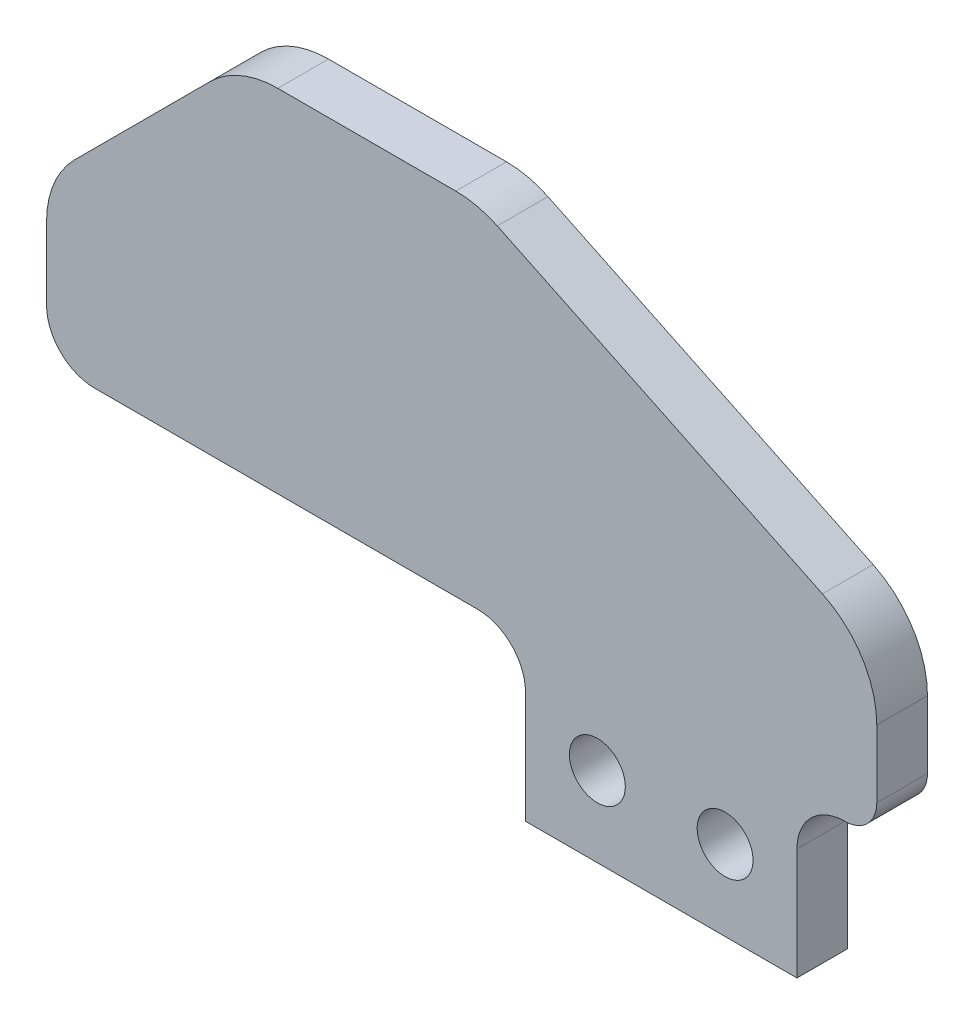
ISO-10303-21;
HEADER;
FILE_DESCRIPTION(('STEP AP214'),'2;1');
FILE_NAME('part.step','',(''),(''),'','','');
FILE_SCHEMA(('AUTOMOTIVE_DESIGN { 1 0 10303 214 1 1 1 1 }'));
ENDSEC;
DATA;
#1=APPLICATION_CONTEXT('core data for automotive mechanical design processes');
#2=APPLICATION_PROTOCOL_DEFINITION('international standard','automotive_design',2000,#1);
#3=PRODUCT_CONTEXT('',#1,'mechanical');
#4=PRODUCT('Part','Part','',(#3));
#5=PRODUCT_RELATED_PRODUCT_CATEGORY('part','',(#4));
#6=PRODUCT_DEFINITION_FORMATION('','',#4);
#7=PRODUCT_DEFINITION_CONTEXT('part definition',#1,'design');
#8=PRODUCT_DEFINITION('design','',#6,#7);
#9=PRODUCT_DEFINITION_SHAPE('','',#8);
#10=(LENGTH_UNIT() NAMED_UNIT(*) SI_UNIT(.MILLI.,.METRE.));
#11=(NAMED_UNIT(*) PLANE_ANGLE_UNIT() SI_UNIT($,.RADIAN.));
#12=(NAMED_UNIT(*) SI_UNIT($,.STERADIAN.) SOLID_ANGLE_UNIT());
#13=UNCERTAINTY_MEASURE_WITH_UNIT(LENGTH_MEASURE(1.E-05),#10,'distance_accuracy_value','');
#14=(GEOMETRIC_REPRESENTATION_CONTEXT(3) GLOBAL_UNCERTAINTY_ASSIGNED_CONTEXT((#13)) GLOBAL_UNIT_ASSIGNED_CONTEXT((#10,
#11,#12)) REPRESENTATION_CONTEXT('',''));
#15=CARTESIAN_POINT('',(0.,0.,0.));
#16=DIRECTION('',(0.,0.,1.));
#17=DIRECTION('',(1.,0.,0.));
#18=AXIS2_PLACEMENT_3D('',#15,#16,#17);
#19=CARTESIAN_POINT('',(8.50000000000001,0.,3.175));
#20=DIRECTION('',(1.,0.,0.));
#21=DIRECTION('',(0.,1.,0.));
#22=AXIS2_PLACEMENT_3D('',#19,#20,#21);
#23=PLANE('',#22);
#24=DIRECTION('',(0.,-1.,0.));
#25=VECTOR('',#24,1.);
#26=CARTESIAN_POINT('',(8.50000000000001,0.,0.));
#27=LINE('',#26,#25);
#28=CARTESIAN_POINT('',(8.5,44.,0.));
#29=VERTEX_POINT('',#28);
#30=CARTESIAN_POINT('',(8.5,37.,0.));
#31=VERTEX_POINT('',#30);
#32=EDGE_CURVE('E257',#29,#31,#27,.T.);
#33=ORIENTED_EDGE('',*,*,#32,.F.);
#34=DIRECTION('',(0.,0.,-1.));
#35=VECTOR('',#34,1.);
#36=CARTESIAN_POINT('',(8.5,44.,3.175));
#37=LINE('',#36,#35);
#38=CARTESIAN_POINT('',(8.5,44.,3.175));
#39=VERTEX_POINT('',#38);
#40=EDGE_CURVE('E228',#29,#39,#37,.F.);
#41=ORIENTED_EDGE('',*,*,#40,.T.);
#42=DIRECTION('',(0.,-1.,0.));
#43=VECTOR('',#42,1.);
#44=CARTESIAN_POINT('',(8.50000000000001,0.,3.175));
#45=LINE('',#44,#43);
#46=CARTESIAN_POINT('',(8.5,37.,3.175));
#47=VERTEX_POINT('',#46);
#48=EDGE_CURVE('E272',#39,#47,#45,.T.);
#49=ORIENTED_EDGE('',*,*,#48,.T.);
#50=DIRECTION('',(0.,0.,-1.));
#51=VECTOR('',#50,1.);
#52=CARTESIAN_POINT('',(8.5,37.,3.175));
#53=LINE('',#52,#51);
#54=EDGE_CURVE('E182',#47,#31,#53,.T.);
#55=ORIENTED_EDGE('',*,*,#54,.T.);
#56=EDGE_LOOP('',(#33,#41,#49,#55));
#57=FACE_BOUND('',#56,.T.);
#58=ADVANCED_FACE('F43',(#57),#23,.T.);
#59=CARTESIAN_POINT('',(13.5,0.,3.175));
#60=DIRECTION('',(-1.,0.,0.));
#61=DIRECTION('',(0.,0.,1.));
#62=AXIS2_PLACEMENT_3D('',#59,#60,#61);
#63=PLANE('',#62);
#64=DIRECTION('',(0.,1.,0.));
#65=VECTOR('',#64,1.);
#66=CARTESIAN_POINT('',(13.5,0.,3.175));
#67=LINE('',#66,#65);
#68=CARTESIAN_POINT('',(13.5,49.,3.175));
#69=VERTEX_POINT('',#68);
#70=CARTESIAN_POINT('',(13.5,53.2245961805462,3.175));
#71=VERTEX_POINT('',#70);
#72=EDGE_CURVE('E280',#69,#71,#67,.T.);
#73=ORIENTED_EDGE('',*,*,#72,.F.);
#74=DIRECTION('',(0.,0.,-1.));
#75=VECTOR('',#74,1.);
#76=CARTESIAN_POINT('',(13.5,49.,3.175));
#77=LINE('',#76,#75);
#78=CARTESIAN_POINT('',(13.5,49.,0.));
#79=VERTEX_POINT('',#78);
#80=EDGE_CURVE('E233',#69,#79,#77,.T.);
#81=ORIENTED_EDGE('',*,*,#80,.T.);
#82=DIRECTION('',(0.,1.,0.));
#83=VECTOR('',#82,1.);
#84=CARTESIAN_POINT('',(13.5,0.,0.));
#85=LINE('',#84,#83);
#86=CARTESIAN_POINT('',(13.5,53.2245961805462,0.));
#87=VERTEX_POINT('',#86);
#88=EDGE_CURVE('E265',#79,#87,#85,.T.);
#89=ORIENTED_EDGE('',*,*,#88,.T.);
#90=DIRECTION('',(0.,0.,-1.));
#91=VECTOR('',#90,1.);
#92=CARTESIAN_POINT('',(13.5,53.2245961805462,3.175));
#93=LINE('',#92,#91);
#94=EDGE_CURVE('E231',#87,#71,#93,.F.);
#95=ORIENTED_EDGE('',*,*,#94,.T.);
#96=EDGE_LOOP('',(#73,#81,#89,#95));
#97=FACE_BOUND('',#96,.T.);
#98=ADVANCED_FACE('F278',(#97),#63,.F.);
#99=CARTESIAN_POINT('',(24.7646293888166,51.592977893368,3.175));
#100=DIRECTION('',(-0.432731067584771,-0.901523057468274,0.));
#101=DIRECTION('',(0.901523057468274,-0.432731067584771,0.));
#102=AXIS2_PLACEMENT_3D('',#99,#100,#101);
#103=PLANE('',#102);
#104=DIRECTION('',(-0.901523057468274,0.432731067584771,0.));
#105=VECTOR('',#104,1.);
#106=CARTESIAN_POINT('',(24.7646293888166,51.592977893368,0.));
#107=LINE('',#106,#105);
#108=CARTESIAN_POINT('',(10.0963864055086,58.6337345253558,0.));
#109=VERTEX_POINT('',#108);
#110=CARTESIAN_POINT('',(-10.2690382183534,68.4091383448096,0.));
#111=VERTEX_POINT('',#110);
#112=EDGE_CURVE('E282',#109,#111,#107,.T.);
#113=ORIENTED_EDGE('',*,*,#112,.T.);
#114=DIRECTION('',(0.,0.,-1.));
#115=VECTOR('',#114,1.);
#116=CARTESIAN_POINT('',(-10.2690382183534,68.4091383448096,3.175));
#117=LINE('',#116,#115);
#118=CARTESIAN_POINT('',(-10.2690382183534,68.4091383448096,3.175));
#119=VERTEX_POINT('',#118);
#120=EDGE_CURVE('E247',#111,#119,#117,.F.);
#121=ORIENTED_EDGE('',*,*,#120,.T.);
#122=DIRECTION('',(-0.901523057468274,0.432731067584771,0.));
#123=VECTOR('',#122,1.);
#124=CARTESIAN_POINT('',(24.7646293888166,51.592977893368,3.175));
#125=LINE('',#124,#123);
#126=CARTESIAN_POINT('',(10.0963864055086,58.6337345253558,3.175));
#127=VERTEX_POINT('',#126);
#128=EDGE_CURVE('E311',#127,#119,#125,.T.);
#129=ORIENTED_EDGE('',*,*,#128,.F.);
#130=DIRECTION('',(0.,0.,-1.));
#131=VECTOR('',#130,1.);
#132=CARTESIAN_POINT('',(10.0963864055086,58.6337345253558,3.175));
#133=LINE('',#132,#131);
#134=EDGE_CURVE('E244',#127,#109,#133,.T.);
#135=ORIENTED_EDGE('',*,*,#134,.T.);
#136=EDGE_LOOP('',(#113,#121,#129,#135));
#137=FACE_BOUND('',#136,.T.);
#138=ADVANCED_FACE('F345',(#137),#103,.F.);
#139=CARTESIAN_POINT('',(0.,69.,3.175));
#140=DIRECTION('',(0.,-1.,0.));
#141=DIRECTION('',(0.,0.,-1.));
#142=AXIS2_PLACEMENT_3D('',#139,#140,#141);
#143=PLANE('',#142);
#144=DIRECTION('',(-1.,0.,0.));
#145=VECTOR('',#144,1.);
#146=CARTESIAN_POINT('',(0.,69.,0.));
#147=LINE('',#146,#145);
#148=CARTESIAN_POINT('',(-12.865424623862,69.,0.));
#149=VERTEX_POINT('',#148);
#150=CARTESIAN_POINT('',(-24.0147186257614,69.,0.));
#151=VERTEX_POINT('',#150);
#152=EDGE_CURVE('E285',#149,#151,#147,.T.);
#153=ORIENTED_EDGE('',*,*,#152,.T.);
#154=DIRECTION('',(0.,0.,-1.));
#155=VECTOR('',#154,1.);
#156=CARTESIAN_POINT('',(-24.0147186257614,69.,3.175));
#157=LINE('',#156,#155);
#158=CARTESIAN_POINT('',(-24.0147186257614,69.,3.175));
#159=VERTEX_POINT('',#158);
#160=EDGE_CURVE('E242',#151,#159,#157,.F.);
#161=ORIENTED_EDGE('',*,*,#160,.T.);
#162=DIRECTION('',(-1.,0.,0.));
#163=VECTOR('',#162,1.);
#164=CARTESIAN_POINT('',(0.,69.,3.175));
#165=LINE('',#164,#163);
#166=CARTESIAN_POINT('',(-12.865424623862,69.,3.175));
#167=VERTEX_POINT('',#166);
#168=EDGE_CURVE('E314',#167,#159,#165,.T.);
#169=ORIENTED_EDGE('',*,*,#168,.F.);
#170=DIRECTION('',(0.,0.,-1.));
#171=VECTOR('',#170,1.);
#172=CARTESIAN_POINT('',(-12.865424623862,69.,3.175));
#173=LINE('',#172,#171);
#174=EDGE_CURVE('E239',#167,#149,#173,.T.);
#175=ORIENTED_EDGE('',*,*,#174,.T.);
#176=EDGE_LOOP('',(#153,#161,#169,#175));
#177=FACE_BOUND('',#176,.T.);
#178=ADVANCED_FACE('F350',(#177),#143,.F.);
#179=CARTESIAN_POINT('',(-47.75,47.75,3.175));
#180=DIRECTION('',(0.707106781186547,-0.707106781186548,0.));
#181=DIRECTION('',(0.707106781186548,0.707106781186547,0.));
#182=AXIS2_PLACEMENT_3D('',#179,#180,#181);
#183=PLANE('',#182);
#184=DIRECTION('',(-0.707106781186548,-0.707106781186547,0.));
#185=VECTOR('',#184,1.);
#186=CARTESIAN_POINT('',(-47.75,47.75,0.));
#187=LINE('',#186,#185);
#188=CARTESIAN_POINT('',(-28.2573593128807,67.2426406871193,0.));
#189=VERTEX_POINT('',#188);
#190=CARTESIAN_POINT('',(-36.7426406871193,58.7573593128807,0.));
#191=VERTEX_POINT('',#190);
#192=EDGE_CURVE('E292',#189,#191,#187,.T.);
#193=ORIENTED_EDGE('',*,*,#192,.T.);
#194=DIRECTION('',(0.,0.,-1.));
#195=VECTOR('',#194,1.);
#196=CARTESIAN_POINT('',(-36.7426406871193,58.7573593128807,3.175));
#197=LINE('',#196,#195);
#198=CARTESIAN_POINT('',(-36.7426406871193,58.7573593128807,3.175));
#199=VERTEX_POINT('',#198);
#200=EDGE_CURVE('E67',#191,#199,#197,.F.);
#201=ORIENTED_EDGE('',*,*,#200,.T.);
#202=DIRECTION('',(-0.707106781186548,-0.707106781186547,0.));
#203=VECTOR('',#202,1.);
#204=CARTESIAN_POINT('',(-47.75,47.75,3.175));
#205=LINE('',#204,#203);
#206=CARTESIAN_POINT('',(-28.2573593128807,67.2426406871193,3.175));
#207=VERTEX_POINT('',#206);
#208=EDGE_CURVE('E317',#207,#199,#205,.T.);
#209=ORIENTED_EDGE('',*,*,#208,.F.);
#210=DIRECTION('',(0.,0.,-1.));
#211=VECTOR('',#210,1.);
#212=CARTESIAN_POINT('',(-28.2573593128807,67.2426406871193,3.175));
#213=LINE('',#212,#211);
#214=EDGE_CURVE('E235',#207,#189,#213,.T.);
#215=ORIENTED_EDGE('',*,*,#214,.T.);
#216=EDGE_LOOP('',(#193,#201,#209,#215));
#217=FACE_BOUND('',#216,.T.);
#218=ADVANCED_FACE('F354',(#217),#183,.F.);
#219=CARTESIAN_POINT('',(-38.5,0.,3.175));
#220=DIRECTION('',(1.,0.,0.));
#221=DIRECTION('',(0.,1.,0.));
#222=AXIS2_PLACEMENT_3D('',#219,#220,#221);
#223=PLANE('',#222);
#224=DIRECTION('',(0.,-1.,0.));
#225=VECTOR('',#224,1.);
#226=CARTESIAN_POINT('',(-38.5,0.,0.));
#227=LINE('',#226,#225);
#228=CARTESIAN_POINT('',(-38.5,54.5147186257614,0.));
#229=VERTEX_POINT('',#228);
#230=CARTESIAN_POINT('',(-38.5,50.,0.));
#231=VERTEX_POINT('',#230);
#232=EDGE_CURVE('E294',#229,#231,#227,.T.);
#233=ORIENTED_EDGE('',*,*,#232,.T.);
#234=DIRECTION('',(0.,0.,-1.));
#235=VECTOR('',#234,1.);
#236=CARTESIAN_POINT('',(-38.5,50.,3.175));
#237=LINE('',#236,#235);
#238=CARTESIAN_POINT('',(-38.5,50.,3.175));
#239=VERTEX_POINT('',#238);
#240=EDGE_CURVE('E212',#231,#239,#237,.F.);
#241=ORIENTED_EDGE('',*,*,#240,.T.);
#242=DIRECTION('',(0.,-1.,0.));
#243=VECTOR('',#242,1.);
#244=CARTESIAN_POINT('',(-38.5,0.,3.175));
#245=LINE('',#244,#243);
#246=CARTESIAN_POINT('',(-38.5,54.5147186257614,3.175));
#247=VERTEX_POINT('',#246);
#248=EDGE_CURVE('E309',#247,#239,#245,.T.);
#249=ORIENTED_EDGE('',*,*,#248,.F.);
#250=DIRECTION('',(0.,0.,-1.));
#251=VECTOR('',#250,1.);
#252=CARTESIAN_POINT('',(-38.5,54.5147186257614,3.175));
#253=LINE('',#252,#251);
#254=EDGE_CURVE('E209',#247,#229,#253,.T.);
#255=ORIENTED_EDGE('',*,*,#254,.T.);
#256=EDGE_LOOP('',(#233,#241,#249,#255));
#257=FACE_BOUND('',#256,.T.);
#258=ADVANCED_FACE('F358',(#257),#223,.F.);
#259=CARTESIAN_POINT('',(0.,47.,3.175));
#260=DIRECTION('',(0.,1.,0.));
#261=DIRECTION('',(0.,0.,1.));
#262=AXIS2_PLACEMENT_3D('',#259,#260,#261);
#263=PLANE('',#262);
#264=DIRECTION('',(1.,0.,0.));
#265=VECTOR('',#264,1.);
#266=CARTESIAN_POINT('',(0.,47.,3.175));
#267=LINE('',#266,#265);
#268=CARTESIAN_POINT('',(-35.5,47.,3.175));
#269=VERTEX_POINT('',#268);
#270=CARTESIAN_POINT('',(-11.5,47.,3.175));
#271=VERTEX_POINT('',#270);
#272=EDGE_CURVE('E174',#269,#271,#267,.T.);
#273=ORIENTED_EDGE('',*,*,#272,.F.);
#274=DIRECTION('',(0.,0.,-1.));
#275=VECTOR('',#274,1.);
#276=CARTESIAN_POINT('',(-35.5,47.,3.175));
#277=LINE('',#276,#275);
#278=CARTESIAN_POINT('',(-35.5,47.,0.));
#279=VERTEX_POINT('',#278);
#280=EDGE_CURVE('E190',#269,#279,#277,.T.);
#281=ORIENTED_EDGE('',*,*,#280,.T.);
#282=DIRECTION('',(1.,0.,0.));
#283=VECTOR('',#282,1.);
#284=CARTESIAN_POINT('',(0.,47.,0.));
#285=LINE('',#284,#283);
#286=CARTESIAN_POINT('',(-11.5,47.,0.));
#287=VERTEX_POINT('',#286);
#288=EDGE_CURVE('E288',#279,#287,#285,.T.);
#289=ORIENTED_EDGE('',*,*,#288,.T.);
#290=DIRECTION('',(0.,0.,-1.));
#291=VECTOR('',#290,1.);
#292=CARTESIAN_POINT('',(-11.5,47.,3.175));
#293=LINE('',#292,#291);
#294=EDGE_CURVE('E188',#287,#271,#293,.F.);
#295=ORIENTED_EDGE('',*,*,#294,.T.);
#296=EDGE_LOOP('',(#273,#281,#289,#295));
#297=FACE_BOUND('',#296,.T.);
#298=ADVANCED_FACE('F337',(#297),#263,.F.);
#299=CARTESIAN_POINT('',(-8.49999999999999,0.,3.175));
#300=DIRECTION('',(1.,0.,0.));
#301=DIRECTION('',(0.,1.,0.));
#302=AXIS2_PLACEMENT_3D('',#299,#300,#301);
#303=PLANE('',#302);
#304=DIRECTION('',(0.,-1.,0.));
#305=VECTOR('',#304,1.);
#306=CARTESIAN_POINT('',(-8.49999999999999,0.,3.175));
#307=LINE('',#306,#305);
#308=CARTESIAN_POINT('',(-8.5,44.,3.175));
#309=VERTEX_POINT('',#308);
#310=CARTESIAN_POINT('',(-8.5,37.,3.175));
#311=VERTEX_POINT('',#310);
#312=EDGE_CURVE('E163',#309,#311,#307,.T.);
#313=ORIENTED_EDGE('',*,*,#312,.F.);
#314=DIRECTION('',(0.,0.,-1.));
#315=VECTOR('',#314,1.);
#316=CARTESIAN_POINT('',(-8.5,44.,0.));
#317=LINE('',#316,#315);
#318=CARTESIAN_POINT('',(-8.5,44.,0.));
#319=VERTEX_POINT('',#318);
#320=EDGE_CURVE('E226',#309,#319,#317,.T.);
#321=ORIENTED_EDGE('',*,*,#320,.T.);
#322=DIRECTION('',(0.,-1.,0.));
#323=VECTOR('',#322,1.);
#324=CARTESIAN_POINT('',(-8.49999999999999,0.,0.));
#325=LINE('',#324,#323);
#326=CARTESIAN_POINT('',(-8.5,37.,0.));
#327=VERTEX_POINT('',#326);
#328=EDGE_CURVE('E186',#319,#327,#325,.T.);
#329=ORIENTED_EDGE('',*,*,#328,.T.);
#330=DIRECTION('',(0.,0.,-1.));
#331=VECTOR('',#330,1.);
#332=CARTESIAN_POINT('',(-8.5,37.,3.175));
#333=LINE('',#332,#331);
#334=EDGE_CURVE('E180',#311,#327,#333,.T.);
#335=ORIENTED_EDGE('',*,*,#334,.F.);
#336=EDGE_LOOP('',(#313,#321,#329,#335));
#337=FACE_BOUND('',#336,.T.);
#338=ADVANCED_FACE('F184',(#337),#303,.F.);
#339=CARTESIAN_POINT('',(4.,42.,3.175));
#340=DIRECTION('',(0.,0.,-1.));
#341=DIRECTION('',(-1.,0.,0.));
#342=AXIS2_PLACEMENT_3D('',#339,#340,#341);
#343=CYLINDRICAL_SURFACE('',#342,1.75);
#344=CARTESIAN_POINT('',(4.,42.,3.175));
#345=DIRECTION('',(0.,0.,1.));
#346=DIRECTION('',(1.,0.,0.));
#347=AXIS2_PLACEMENT_3D('',#344,#345,#346);
#348=CIRCLE('',#347,1.75);
#349=CARTESIAN_POINT('',(5.75,42.,3.175));
#350=VERTEX_POINT('',#349);
#351=EDGE_CURVE('E300',#350,#350,#348,.T.);
#352=ORIENTED_EDGE('',*,*,#351,.T.);
#353=EDGE_LOOP('',(#352));
#354=FACE_BOUND('',#353,.T.);
#355=CARTESIAN_POINT('',(4.,42.,0.));
#356=DIRECTION('',(0.,0.,1.));
#357=DIRECTION('',(1.,0.,0.));
#358=AXIS2_PLACEMENT_3D('',#355,#356,#357);
#359=CIRCLE('',#358,1.75);
#360=CARTESIAN_POINT('',(5.75,42.,0.));
#361=VERTEX_POINT('',#360);
#362=EDGE_CURVE('E266',#361,#361,#359,.T.);
#363=ORIENTED_EDGE('',*,*,#362,.F.);
#364=EDGE_LOOP('',(#363));
#365=FACE_BOUND('',#364,.T.);
#366=ADVANCED_FACE('F327',(#354,#365),#343,.F.);
#367=CARTESIAN_POINT('',(-4.,42.,3.175));
#368=DIRECTION('',(0.,0.,-1.));
#369=DIRECTION('',(-1.,0.,0.));
#370=AXIS2_PLACEMENT_3D('',#367,#368,#369);
#371=CYLINDRICAL_SURFACE('',#370,1.75);
#372=CARTESIAN_POINT('',(-4.,42.,3.175));
#373=DIRECTION('',(0.,0.,1.));
#374=DIRECTION('',(1.,0.,0.));
#375=AXIS2_PLACEMENT_3D('',#372,#373,#374);
#376=CIRCLE('',#375,1.75);
#377=CARTESIAN_POINT('',(-2.24999999999999,42.,3.175));
#378=VERTEX_POINT('',#377);
#379=EDGE_CURVE('E298',#378,#378,#376,.T.);
#380=ORIENTED_EDGE('',*,*,#379,.T.);
#381=EDGE_LOOP('',(#380));
#382=FACE_BOUND('',#381,.T.);
#383=CARTESIAN_POINT('',(-4.,42.,0.));
#384=DIRECTION('',(0.,0.,1.));
#385=DIRECTION('',(1.,0.,0.));
#386=AXIS2_PLACEMENT_3D('',#383,#384,#385);
#387=CIRCLE('',#386,1.75);
#388=CARTESIAN_POINT('',(-2.24999999999999,42.,0.));
#389=VERTEX_POINT('',#388);
#390=EDGE_CURVE('E320',#389,#389,#387,.T.);
#391=ORIENTED_EDGE('',*,*,#390,.F.);
#392=EDGE_LOOP('',(#391));
#393=FACE_BOUND('',#392,.T.);
#394=ADVANCED_FACE('F329',(#382,#393),#371,.F.);
#395=CARTESIAN_POINT('',(0.,37.,3.175));
#396=DIRECTION('',(0.,1.,0.));
#397=DIRECTION('',(0.,0.,1.));
#398=AXIS2_PLACEMENT_3D('',#395,#396,#397);
#399=PLANE('',#398);
#400=DIRECTION('',(1.,0.,0.));
#401=VECTOR('',#400,1.);
#402=CARTESIAN_POINT('',(0.,37.,0.));
#403=LINE('',#402,#401);
#404=EDGE_CURVE('E297',#327,#31,#403,.T.);
#405=ORIENTED_EDGE('',*,*,#404,.T.);
#406=ORIENTED_EDGE('',*,*,#54,.F.);
#407=DIRECTION('',(1.,0.,0.));
#408=VECTOR('',#407,1.);
#409=CARTESIAN_POINT('',(0.,37.,3.175));
#410=LINE('',#409,#408);
#411=EDGE_CURVE('E168',#311,#47,#410,.T.);
#412=ORIENTED_EDGE('',*,*,#411,.F.);
#413=ORIENTED_EDGE('',*,*,#334,.T.);
#414=EDGE_LOOP('',(#405,#406,#412,#413));
#415=FACE_BOUND('',#414,.T.);
#416=ADVANCED_FACE('F179',(#415),#399,.F.);
#417=CARTESIAN_POINT('',(0.,0.,3.175));
#418=DIRECTION('',(0.,0.,1.));
#419=DIRECTION('',(1.,0.,0.));
#420=AXIS2_PLACEMENT_3D('',#417,#418,#419);
#421=PLANE('',#420);
#422=ORIENTED_EDGE('',*,*,#379,.F.);
#423=EDGE_LOOP('',(#422));
#424=FACE_BOUND('',#423,.T.);
#425=ORIENTED_EDGE('',*,*,#351,.F.);
#426=EDGE_LOOP('',(#425));
#427=FACE_BOUND('',#426,.T.);
#428=ORIENTED_EDGE('',*,*,#248,.T.);
#429=CARTESIAN_POINT('',(-35.5,50.,3.175));
#430=DIRECTION('',(0.,0.,1.));
#431=DIRECTION('',(1.,0.,0.));
#432=AXIS2_PLACEMENT_3D('',#429,#430,#431);
#433=CIRCLE('',#432,3.);
#434=EDGE_CURVE('E224',#239,#269,#433,.T.);
#435=ORIENTED_EDGE('',*,*,#434,.T.);
#436=ORIENTED_EDGE('',*,*,#272,.T.);
#437=CARTESIAN_POINT('',(-11.5,44.,3.175));
#438=DIRECTION('',(0.,0.,1.));
#439=DIRECTION('',(1.,0.,0.));
#440=AXIS2_PLACEMENT_3D('',#437,#438,#439);
#441=CIRCLE('',#440,3.);
#442=EDGE_CURVE('E59',#271,#309,#441,.F.);
#443=ORIENTED_EDGE('',*,*,#442,.T.);
#444=ORIENTED_EDGE('',*,*,#312,.T.);
#445=ORIENTED_EDGE('',*,*,#411,.T.);
#446=ORIENTED_EDGE('',*,*,#48,.F.);
#447=CARTESIAN_POINT('',(11.5,44.,3.175));
#448=DIRECTION('',(0.,0.,1.));
#449=DIRECTION('',(1.,0.,0.));
#450=AXIS2_PLACEMENT_3D('',#447,#448,#449);
#451=CIRCLE('',#450,3.);
#452=CARTESIAN_POINT('',(11.5,47.,3.175));
#453=VERTEX_POINT('',#452);
#454=EDGE_CURVE('E12',#39,#453,#451,.F.);
#455=ORIENTED_EDGE('',*,*,#454,.T.);
#456=CARTESIAN_POINT('',(11.5,49.,3.175));
#457=DIRECTION('',(0.,0.,1.));
#458=DIRECTION('',(1.,0.,0.));
#459=AXIS2_PLACEMENT_3D('',#456,#457,#458);
#460=CIRCLE('',#459,2.);
#461=EDGE_CURVE('E222',#453,#69,#460,.T.);
#462=ORIENTED_EDGE('',*,*,#461,.T.);
#463=ORIENTED_EDGE('',*,*,#72,.T.);
#464=CARTESIAN_POINT('',(7.5,53.2245961805462,3.175));
#465=DIRECTION('',(0.,0.,1.));
#466=DIRECTION('',(1.,0.,0.));
#467=AXIS2_PLACEMENT_3D('',#464,#465,#466);
#468=CIRCLE('',#467,6.);
#469=EDGE_CURVE('E214',#71,#127,#468,.T.);
#470=ORIENTED_EDGE('',*,*,#469,.T.);
#471=ORIENTED_EDGE('',*,*,#128,.T.);
#472=CARTESIAN_POINT('',(-12.865424623862,63.,3.175));
#473=DIRECTION('',(0.,0.,1.));
#474=DIRECTION('',(1.,0.,0.));
#475=AXIS2_PLACEMENT_3D('',#472,#473,#474);
#476=CIRCLE('',#475,6.);
#477=EDGE_CURVE('E216',#119,#167,#476,.T.);
#478=ORIENTED_EDGE('',*,*,#477,.T.);
#479=ORIENTED_EDGE('',*,*,#168,.T.);
#480=CARTESIAN_POINT('',(-24.0147186257614,63.,3.175));
#481=DIRECTION('',(0.,0.,1.));
#482=DIRECTION('',(1.,0.,0.));
#483=AXIS2_PLACEMENT_3D('',#480,#481,#482);
#484=CIRCLE('',#483,6.);
#485=EDGE_CURVE('E218',#159,#207,#484,.T.);
#486=ORIENTED_EDGE('',*,*,#485,.T.);
#487=ORIENTED_EDGE('',*,*,#208,.T.);
#488=CARTESIAN_POINT('',(-32.5,54.5147186257614,3.175));
#489=DIRECTION('',(0.,0.,1.));
#490=DIRECTION('',(1.,0.,0.));
#491=AXIS2_PLACEMENT_3D('',#488,#489,#490);
#492=CIRCLE('',#491,6.);
#493=EDGE_CURVE('E220',#199,#247,#492,.T.);
#494=ORIENTED_EDGE('',*,*,#493,.T.);
#495=EDGE_LOOP('',(#428,#435,#436,#443,#444,#445,#446,#455,#462,#463,#470,#471,#478,#479,#486,
#487,#494));
#496=FACE_BOUND('',#495,.T.);
#497=ADVANCED_FACE('F166',(#424,#427,#496),#421,.T.);
#498=CARTESIAN_POINT('',(0.,0.,0.));
#499=DIRECTION('',(0.,0.,1.));
#500=DIRECTION('',(1.,0.,0.));
#501=AXIS2_PLACEMENT_3D('',#498,#499,#500);
#502=PLANE('',#501);
#503=ORIENTED_EDGE('',*,*,#390,.T.);
#504=EDGE_LOOP('',(#503));
#505=FACE_BOUND('',#504,.T.);
#506=ORIENTED_EDGE('',*,*,#362,.T.);
#507=EDGE_LOOP('',(#506));
#508=FACE_BOUND('',#507,.T.);
#509=ORIENTED_EDGE('',*,*,#288,.F.);
#510=CARTESIAN_POINT('',(-35.5,50.,0.));
#511=DIRECTION('',(0.,0.,1.));
#512=DIRECTION('',(1.,0.,0.));
#513=AXIS2_PLACEMENT_3D('',#510,#511,#512);
#514=CIRCLE('',#513,3.);
#515=EDGE_CURVE('E207',#279,#231,#514,.F.);
#516=ORIENTED_EDGE('',*,*,#515,.T.);
#517=ORIENTED_EDGE('',*,*,#232,.F.);
#518=CARTESIAN_POINT('',(-32.5,54.5147186257614,0.));
#519=DIRECTION('',(0.,0.,1.));
#520=DIRECTION('',(1.,0.,0.));
#521=AXIS2_PLACEMENT_3D('',#518,#519,#520);
#522=CIRCLE('',#521,6.);
#523=EDGE_CURVE('E203',#229,#191,#522,.F.);
#524=ORIENTED_EDGE('',*,*,#523,.T.);
#525=ORIENTED_EDGE('',*,*,#192,.F.);
#526=CARTESIAN_POINT('',(-24.0147186257614,63.,0.));
#527=DIRECTION('',(0.,0.,1.));
#528=DIRECTION('',(1.,0.,0.));
#529=AXIS2_PLACEMENT_3D('',#526,#527,#528);
#530=CIRCLE('',#529,6.);
#531=EDGE_CURVE('E201',#189,#151,#530,.F.);
#532=ORIENTED_EDGE('',*,*,#531,.T.);
#533=ORIENTED_EDGE('',*,*,#152,.F.);
#534=CARTESIAN_POINT('',(-12.865424623862,63.,0.));
#535=DIRECTION('',(0.,0.,1.));
#536=DIRECTION('',(1.,0.,0.));
#537=AXIS2_PLACEMENT_3D('',#534,#535,#536);
#538=CIRCLE('',#537,6.);
#539=EDGE_CURVE('E199',#149,#111,#538,.F.);
#540=ORIENTED_EDGE('',*,*,#539,.T.);
#541=ORIENTED_EDGE('',*,*,#112,.F.);
#542=CARTESIAN_POINT('',(7.5,53.2245961805462,0.));
#543=DIRECTION('',(0.,0.,1.));
#544=DIRECTION('',(1.,0.,0.));
#545=AXIS2_PLACEMENT_3D('',#542,#543,#544);
#546=CIRCLE('',#545,6.);
#547=EDGE_CURVE('E197',#109,#87,#546,.F.);
#548=ORIENTED_EDGE('',*,*,#547,.T.);
#549=ORIENTED_EDGE('',*,*,#88,.F.);
#550=CARTESIAN_POINT('',(11.5,49.,0.));
#551=DIRECTION('',(0.,0.,1.));
#552=DIRECTION('',(1.,0.,0.));
#553=AXIS2_PLACEMENT_3D('',#550,#551,#552);
#554=CIRCLE('',#553,2.);
#555=CARTESIAN_POINT('',(11.5,47.,0.));
#556=VERTEX_POINT('',#555);
#557=EDGE_CURVE('E205',#79,#556,#554,.F.);
#558=ORIENTED_EDGE('',*,*,#557,.T.);
#559=CARTESIAN_POINT('',(11.5,44.,0.));
#560=DIRECTION('',(0.,0.,1.));
#561=DIRECTION('',(1.,0.,0.));
#562=AXIS2_PLACEMENT_3D('',#559,#560,#561);
#563=CIRCLE('',#562,3.);
#564=EDGE_CURVE('E52',#556,#29,#563,.T.);
#565=ORIENTED_EDGE('',*,*,#564,.T.);
#566=ORIENTED_EDGE('',*,*,#32,.T.);
#567=ORIENTED_EDGE('',*,*,#404,.F.);
#568=ORIENTED_EDGE('',*,*,#328,.F.);
#569=CARTESIAN_POINT('',(-11.5,44.,0.));
#570=DIRECTION('',(0.,0.,1.));
#571=DIRECTION('',(1.,0.,0.));
#572=AXIS2_PLACEMENT_3D('',#569,#570,#571);
#573=CIRCLE('',#572,3.);
#574=EDGE_CURVE('E249',#319,#287,#573,.T.);
#575=ORIENTED_EDGE('',*,*,#574,.T.);
#576=EDGE_LOOP('',(#509,#516,#517,#524,#525,#532,#533,#540,#541,#548,#549,#558,#565,#566,#567,
#568,#575));
#577=FACE_BOUND('',#576,.T.);
#578=ADVANCED_FACE('F256',(#505,#508,#577),#502,.F.);
#579=CARTESIAN_POINT('',(-35.5,50.,3.175));
#580=DIRECTION('',(0.,0.,-1.));
#581=DIRECTION('',(-1.,0.,0.));
#582=AXIS2_PLACEMENT_3D('',#579,#580,#581);
#583=CYLINDRICAL_SURFACE('',#582,3.);
#584=ORIENTED_EDGE('',*,*,#434,.F.);
#585=ORIENTED_EDGE('',*,*,#240,.F.);
#586=ORIENTED_EDGE('',*,*,#515,.F.);
#587=ORIENTED_EDGE('',*,*,#280,.F.);
#588=EDGE_LOOP('',(#584,#585,#586,#587));
#589=FACE_BOUND('',#588,.T.);
#590=ADVANCED_FACE('F368',(#589),#583,.T.);
#591=CARTESIAN_POINT('',(-11.5,44.,3.175));
#592=DIRECTION('',(0.,0.,1.));
#593=DIRECTION('',(1.,0.,0.));
#594=AXIS2_PLACEMENT_3D('',#591,#592,#593);
#595=CYLINDRICAL_SURFACE('',#594,3.);
#596=ORIENTED_EDGE('',*,*,#442,.F.);
#597=ORIENTED_EDGE('',*,*,#294,.F.);
#598=ORIENTED_EDGE('',*,*,#574,.F.);
#599=ORIENTED_EDGE('',*,*,#320,.F.);
#600=EDGE_LOOP('',(#596,#597,#598,#599));
#601=FACE_BOUND('',#600,.T.);
#602=ADVANCED_FACE('F390',(#601),#595,.F.);
#603=CARTESIAN_POINT('',(11.5,49.,3.175));
#604=DIRECTION('',(0.,0.,-1.));
#605=DIRECTION('',(-1.,0.,0.));
#606=AXIS2_PLACEMENT_3D('',#603,#604,#605);
#607=CYLINDRICAL_SURFACE('',#606,2.);
#608=ORIENTED_EDGE('',*,*,#80,.F.);
#609=ORIENTED_EDGE('',*,*,#461,.F.);
#610=DIRECTION('',(0.,0.,-1.));
#611=VECTOR('',#610,1.);
#612=CARTESIAN_POINT('',(11.5,47.,3.175));
#613=LINE('',#612,#611);
#614=EDGE_CURVE('E47',#556,#453,#613,.F.);
#615=ORIENTED_EDGE('',*,*,#614,.F.);
#616=ORIENTED_EDGE('',*,*,#557,.F.);
#617=EDGE_LOOP('',(#608,#609,#615,#616));
#618=FACE_BOUND('',#617,.T.);
#619=ADVANCED_FACE('F275',(#618),#607,.T.);
#620=CARTESIAN_POINT('',(11.5,44.,3.175));
#621=DIRECTION('',(0.,0.,-1.));
#622=DIRECTION('',(-1.,0.,0.));
#623=AXIS2_PLACEMENT_3D('',#620,#621,#622);
#624=CYLINDRICAL_SURFACE('',#623,3.);
#625=ORIENTED_EDGE('',*,*,#454,.F.);
#626=ORIENTED_EDGE('',*,*,#40,.F.);
#627=ORIENTED_EDGE('',*,*,#564,.F.);
#628=ORIENTED_EDGE('',*,*,#614,.T.);
#629=EDGE_LOOP('',(#625,#626,#627,#628));
#630=FACE_BOUND('',#629,.T.);
#631=ADVANCED_FACE('F268',(#630),#624,.F.);
#632=CARTESIAN_POINT('',(-32.5,54.5147186257614,3.175));
#633=DIRECTION('',(0.,0.,-1.));
#634=DIRECTION('',(-1.,0.,0.));
#635=AXIS2_PLACEMENT_3D('',#632,#633,#634);
#636=CYLINDRICAL_SURFACE('',#635,6.);
#637=ORIENTED_EDGE('',*,*,#493,.F.);
#638=ORIENTED_EDGE('',*,*,#200,.F.);
#639=ORIENTED_EDGE('',*,*,#523,.F.);
#640=ORIENTED_EDGE('',*,*,#254,.F.);
#641=EDGE_LOOP('',(#637,#638,#639,#640));
#642=FACE_BOUND('',#641,.T.);
#643=ADVANCED_FACE('F414',(#642),#636,.T.);
#644=CARTESIAN_POINT('',(-24.0147186257614,63.,3.175));
#645=DIRECTION('',(0.,0.,-1.));
#646=DIRECTION('',(-1.,0.,0.));
#647=AXIS2_PLACEMENT_3D('',#644,#645,#646);
#648=CYLINDRICAL_SURFACE('',#647,6.);
#649=ORIENTED_EDGE('',*,*,#485,.F.);
#650=ORIENTED_EDGE('',*,*,#160,.F.);
#651=ORIENTED_EDGE('',*,*,#531,.F.);
#652=ORIENTED_EDGE('',*,*,#214,.F.);
#653=EDGE_LOOP('',(#649,#650,#651,#652));
#654=FACE_BOUND('',#653,.T.);
#655=ADVANCED_FACE('F422',(#654),#648,.T.);
#656=CARTESIAN_POINT('',(-12.865424623862,63.,3.175));
#657=DIRECTION('',(0.,0.,-1.));
#658=DIRECTION('',(-1.,0.,0.));
#659=AXIS2_PLACEMENT_3D('',#656,#657,#658);
#660=CYLINDRICAL_SURFACE('',#659,6.);
#661=ORIENTED_EDGE('',*,*,#477,.F.);
#662=ORIENTED_EDGE('',*,*,#120,.F.);
#663=ORIENTED_EDGE('',*,*,#539,.F.);
#664=ORIENTED_EDGE('',*,*,#174,.F.);
#665=EDGE_LOOP('',(#661,#662,#663,#664));
#666=FACE_BOUND('',#665,.T.);
#667=ADVANCED_FACE('F431',(#666),#660,.T.);
#668=CARTESIAN_POINT('',(7.5,53.2245961805462,3.175));
#669=DIRECTION('',(0.,0.,-1.));
#670=DIRECTION('',(-1.,0.,0.));
#671=AXIS2_PLACEMENT_3D('',#668,#669,#670);
#672=CYLINDRICAL_SURFACE('',#671,6.);
#673=ORIENTED_EDGE('',*,*,#469,.F.);
#674=ORIENTED_EDGE('',*,*,#94,.F.);
#675=ORIENTED_EDGE('',*,*,#547,.F.);
#676=ORIENTED_EDGE('',*,*,#134,.F.);
#677=EDGE_LOOP('',(#673,#674,#675,#676));
#678=FACE_BOUND('',#677,.T.);
#679=ADVANCED_FACE('F45',(#678),#672,.T.);
#680=CLOSED_SHELL('',(#58,#98,#138,#178,#218,#258,#298,#338,#366,#394,#416,#497,#578,#590,#602,
#619,#631,#643,#655,#667,#679));
#681=MANIFOLD_SOLID_BREP('B2',#680);
#682=ADVANCED_BREP_SHAPE_REPRESENTATION('',(#18,#681),#14);
#683=SHAPE_DEFINITION_REPRESENTATION(#9,#682);
ENDSEC;
END-ISO-10303-21;
